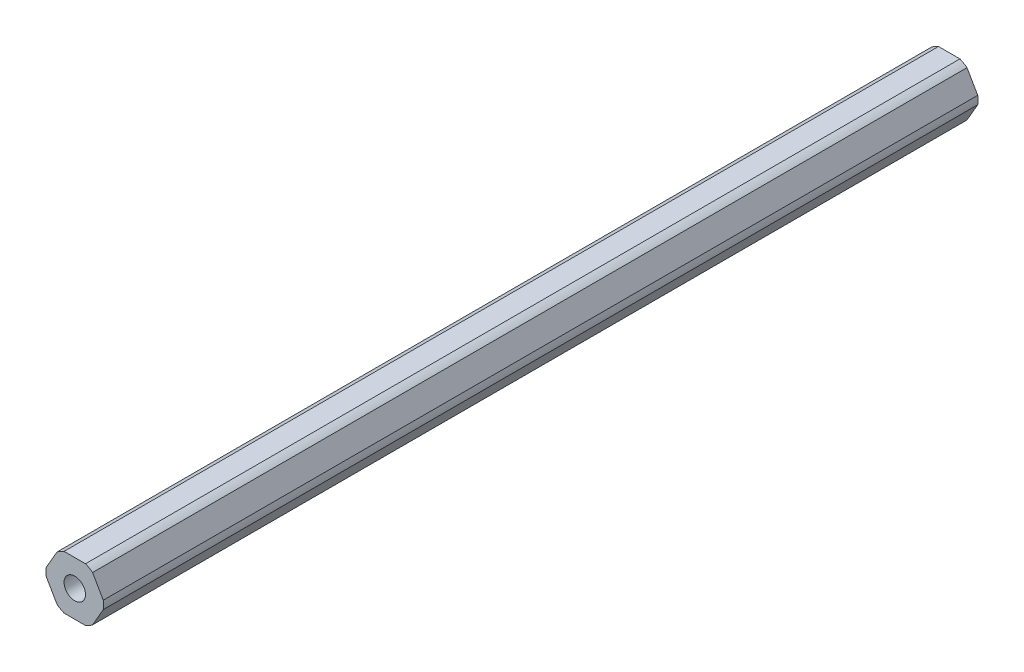
ISO-10303-21;
HEADER;
FILE_DESCRIPTION(('STEP AP214'),'2;1');
FILE_NAME('part.step','',(''),(''),'','','');
FILE_SCHEMA(('AUTOMOTIVE_DESIGN { 1 0 10303 214 1 1 1 1 }'));
ENDSEC;
DATA;
#1=APPLICATION_CONTEXT('core data for automotive mechanical design processes');
#2=APPLICATION_PROTOCOL_DEFINITION('international standard','automotive_design',2000,#1);
#3=PRODUCT_CONTEXT('',#1,'mechanical');
#4=PRODUCT('Part','Part','',(#3));
#5=PRODUCT_RELATED_PRODUCT_CATEGORY('part','',(#4));
#6=PRODUCT_DEFINITION_FORMATION('','',#4);
#7=PRODUCT_DEFINITION_CONTEXT('part definition',#1,'design');
#8=PRODUCT_DEFINITION('design','',#6,#7);
#9=PRODUCT_DEFINITION_SHAPE('','',#8);
#10=(LENGTH_UNIT() NAMED_UNIT(*) SI_UNIT(.MILLI.,.METRE.));
#11=(NAMED_UNIT(*) PLANE_ANGLE_UNIT() SI_UNIT($,.RADIAN.));
#12=(NAMED_UNIT(*) SI_UNIT($,.STERADIAN.) SOLID_ANGLE_UNIT());
#13=UNCERTAINTY_MEASURE_WITH_UNIT(LENGTH_MEASURE(1.E-05),#10,'distance_accuracy_value','');
#14=(GEOMETRIC_REPRESENTATION_CONTEXT(3) GLOBAL_UNCERTAINTY_ASSIGNED_CONTEXT((#13)) GLOBAL_UNIT_ASSIGNED_CONTEXT((#10,
#11,#12)) REPRESENTATION_CONTEXT('',''));
#15=CARTESIAN_POINT('',(0.,0.,0.));
#16=DIRECTION('',(0.,0.,1.));
#17=DIRECTION('',(1.,0.,0.));
#18=AXIS2_PLACEMENT_3D('',#15,#16,#17);
#19=CARTESIAN_POINT('',(0.,0.,-457.2));
#20=DIRECTION('',(0.,0.,1.));
#21=DIRECTION('',(1.,0.,0.));
#22=AXIS2_PLACEMENT_3D('',#19,#20,#21);
#23=CYLINDRICAL_SURFACE('',#22,6.87);
#24=DIRECTION('',(0.,0.,1.));
#25=VECTOR('',#24,1.);
#26=CARTESIAN_POINT('',(6.80102150534208,-0.971085209378955,457.2));
#27=LINE('',#26,#25);
#28=CARTESIAN_POINT('',(6.80102150534208,-0.971085209378954,457.2));
#29=VERTEX_POINT('',#28);
#30=CARTESIAN_POINT('',(6.80102150534208,-0.971085209378953,248.666));
#31=VERTEX_POINT('',#30);
#32=EDGE_CURVE('E200',#29,#31,#27,.F.);
#33=ORIENTED_EDGE('',*,*,#32,.T.);
#34=CARTESIAN_POINT('',(0.,0.,248.666));
#35=DIRECTION('',(0.,0.,-1.));
#36=DIRECTION('',(0.,1.,0.));
#37=AXIS2_PLACEMENT_3D('',#34,#35,#36);
#38=CIRCLE('',#37,6.87);
#39=CARTESIAN_POINT('',(6.80102150534208,0.971085209378948,248.666));
#40=VERTEX_POINT('',#39);
#41=EDGE_CURVE('E318',#31,#40,#38,.F.);
#42=ORIENTED_EDGE('',*,*,#41,.T.);
#43=DIRECTION('',(0.,0.,1.));
#44=VECTOR('',#43,1.);
#45=CARTESIAN_POINT('',(6.80102150534208,0.97108520937895,457.2));
#46=LINE('',#45,#44);
#47=CARTESIAN_POINT('',(6.80102150534208,0.971085209378948,457.2));
#48=VERTEX_POINT('',#47);
#49=EDGE_CURVE('E178',#40,#48,#46,.T.);
#50=ORIENTED_EDGE('',*,*,#49,.T.);
#51=CARTESIAN_POINT('',(0.,0.,457.2));
#52=DIRECTION('',(0.,0.,1.));
#53=DIRECTION('',(1.,0.,0.));
#54=AXIS2_PLACEMENT_3D('',#51,#52,#53);
#55=CIRCLE('',#54,6.87);
#56=EDGE_CURVE('E82',#48,#29,#55,.F.);
#57=ORIENTED_EDGE('',*,*,#56,.T.);
#58=EDGE_LOOP('',(#33,#42,#50,#57));
#59=FACE_BOUND('',#58,.T.);
#60=ADVANCED_FACE('F53',(#59),#23,.T.);
#61=CARTESIAN_POINT('',(3.68083890619154,6.3754,457.2));
#62=DIRECTION('',(0.,-1.,0.));
#63=DIRECTION('',(1.,0.,0.));
#64=AXIS2_PLACEMENT_3D('',#61,#62,#63);
#65=PLANE('',#64);
#66=DIRECTION('',(1.,0.,0.));
#67=VECTOR('',#66,1.);
#68=CARTESIAN_POINT('',(3.68083890619153,6.3754,248.666));
#69=LINE('',#68,#67);
#70=CARTESIAN_POINT('',(-2.55952629210953,6.3754,248.666));
#71=VERTEX_POINT('',#70);
#72=CARTESIAN_POINT('',(2.55952629210953,6.37540000000001,248.666));
#73=VERTEX_POINT('',#72);
#74=EDGE_CURVE('E71',#71,#73,#69,.T.);
#75=ORIENTED_EDGE('',*,*,#74,.F.);
#76=DIRECTION('',(0.,0.,1.));
#77=VECTOR('',#76,1.);
#78=CARTESIAN_POINT('',(-2.55952629210953,6.37540000000001,-457.2));
#79=LINE('',#78,#77);
#80=CARTESIAN_POINT('',(-2.55952629210953,6.37540000000001,457.2));
#81=VERTEX_POINT('',#80);
#82=EDGE_CURVE('E224',#81,#71,#79,.F.);
#83=ORIENTED_EDGE('',*,*,#82,.F.);
#84=DIRECTION('',(1.,0.,0.));
#85=VECTOR('',#84,1.);
#86=CARTESIAN_POINT('',(0.,6.3754,457.2));
#87=LINE('',#86,#85);
#88=CARTESIAN_POINT('',(2.55952629210953,6.37540000000001,457.2));
#89=VERTEX_POINT('',#88);
#90=EDGE_CURVE('E251',#89,#81,#87,.F.);
#91=ORIENTED_EDGE('',*,*,#90,.F.);
#92=DIRECTION('',(0.,0.,1.));
#93=VECTOR('',#92,1.);
#94=CARTESIAN_POINT('',(2.55952629210953,6.37540000000001,-457.2));
#95=LINE('',#94,#93);
#96=EDGE_CURVE('E185',#73,#89,#95,.T.);
#97=ORIENTED_EDGE('',*,*,#96,.F.);
#98=EDGE_LOOP('',(#75,#83,#91,#97));
#99=FACE_BOUND('',#98,.T.);
#100=ADVANCED_FACE('F282',(#99),#65,.F.);
#101=CARTESIAN_POINT('',(0.,0.,-457.2));
#102=DIRECTION('',(0.,0.,1.));
#103=DIRECTION('',(1.,0.,0.));
#104=AXIS2_PLACEMENT_3D('',#101,#102,#103);
#105=CYLINDRICAL_SURFACE('',#104,6.87);
#106=ORIENTED_EDGE('',*,*,#82,.T.);
#107=CARTESIAN_POINT('',(0.,0.,248.666));
#108=DIRECTION('',(0.,0.,-1.));
#109=DIRECTION('',(0.,1.,0.));
#110=AXIS2_PLACEMENT_3D('',#107,#108,#109);
#111=CIRCLE('',#110,6.87);
#112=CARTESIAN_POINT('',(-4.24149521323255,5.40431479062105,248.666));
#113=VERTEX_POINT('',#112);
#114=EDGE_CURVE('E254',#71,#113,#111,.F.);
#115=ORIENTED_EDGE('',*,*,#114,.T.);
#116=DIRECTION('',(0.,0.,1.));
#117=VECTOR('',#116,1.);
#118=CARTESIAN_POINT('',(-4.24149521323255,5.40431479062104,457.2));
#119=LINE('',#118,#117);
#120=CARTESIAN_POINT('',(-4.24149521323255,5.40431479062105,457.2));
#121=VERTEX_POINT('',#120);
#122=EDGE_CURVE('E221',#113,#121,#119,.T.);
#123=ORIENTED_EDGE('',*,*,#122,.T.);
#124=CARTESIAN_POINT('',(0.,0.,457.2));
#125=DIRECTION('',(0.,0.,1.));
#126=DIRECTION('',(1.,0.,0.));
#127=AXIS2_PLACEMENT_3D('',#124,#125,#126);
#128=CIRCLE('',#127,6.87);
#129=EDGE_CURVE('E247',#81,#121,#128,.T.);
#130=ORIENTED_EDGE('',*,*,#129,.F.);
#131=EDGE_LOOP('',(#106,#115,#123,#130));
#132=FACE_BOUND('',#131,.T.);
#133=ADVANCED_FACE('F283',(#132),#105,.T.);
#134=CARTESIAN_POINT('',(-3.68083890619154,6.3754,457.2));
#135=DIRECTION('',(0.866025403784439,-0.5,0.));
#136=DIRECTION('',(0.5,0.866025403784439,0.));
#137=AXIS2_PLACEMENT_3D('',#134,#135,#136);
#138=PLANE('',#137);
#139=DIRECTION('',(0.5,0.866025403784439,0.));
#140=VECTOR('',#139,1.);
#141=CARTESIAN_POINT('',(-3.68083890619155,6.37539999999999,248.666));
#142=LINE('',#141,#140);
#143=CARTESIAN_POINT('',(-6.80102150534208,0.971085209378961,248.666));
#144=VERTEX_POINT('',#143);
#145=EDGE_CURVE('E258',#144,#113,#142,.T.);
#146=ORIENTED_EDGE('',*,*,#145,.F.);
#147=DIRECTION('',(0.,0.,1.));
#148=VECTOR('',#147,1.);
#149=CARTESIAN_POINT('',(-6.80102150534208,0.971085209378959,-457.2));
#150=LINE('',#149,#148);
#151=CARTESIAN_POINT('',(-6.80102150534208,0.971085209378961,457.2));
#152=VERTEX_POINT('',#151);
#153=EDGE_CURVE('E217',#152,#144,#150,.F.);
#154=ORIENTED_EDGE('',*,*,#153,.F.);
#155=DIRECTION('',(-0.5,-0.866025403784439,0.));
#156=VECTOR('',#155,1.);
#157=CARTESIAN_POINT('',(-4.24149521323255,5.40431479062104,457.2));
#158=LINE('',#157,#156);
#159=EDGE_CURVE('E246',#121,#152,#158,.T.);
#160=ORIENTED_EDGE('',*,*,#159,.F.);
#161=ORIENTED_EDGE('',*,*,#122,.F.);
#162=EDGE_LOOP('',(#146,#154,#160,#161));
#163=FACE_BOUND('',#162,.T.);
#164=ADVANCED_FACE('F286',(#163),#138,.F.);
#165=CARTESIAN_POINT('',(0.,0.,-457.2));
#166=DIRECTION('',(0.,0.,1.));
#167=DIRECTION('',(1.,0.,0.));
#168=AXIS2_PLACEMENT_3D('',#165,#166,#167);
#169=CYLINDRICAL_SURFACE('',#168,6.87);
#170=ORIENTED_EDGE('',*,*,#153,.T.);
#171=CARTESIAN_POINT('',(0.,0.,248.666));
#172=DIRECTION('',(0.,0.,-1.));
#173=DIRECTION('',(0.,1.,0.));
#174=AXIS2_PLACEMENT_3D('',#171,#172,#173);
#175=CIRCLE('',#174,6.87);
#176=CARTESIAN_POINT('',(-6.80102150534208,-0.971085209378955,248.666));
#177=VERTEX_POINT('',#176);
#178=EDGE_CURVE('E262',#144,#177,#175,.F.);
#179=ORIENTED_EDGE('',*,*,#178,.T.);
#180=DIRECTION('',(0.,0.,1.));
#181=VECTOR('',#180,1.);
#182=CARTESIAN_POINT('',(-6.80102150534208,-0.971085209378956,457.2));
#183=LINE('',#182,#181);
#184=CARTESIAN_POINT('',(-6.80102150534208,-0.971085209378955,457.2));
#185=VERTEX_POINT('',#184);
#186=EDGE_CURVE('E214',#177,#185,#183,.T.);
#187=ORIENTED_EDGE('',*,*,#186,.T.);
#188=CARTESIAN_POINT('',(0.,0.,457.2));
#189=DIRECTION('',(0.,0.,1.));
#190=DIRECTION('',(1.,0.,0.));
#191=AXIS2_PLACEMENT_3D('',#188,#189,#190);
#192=CIRCLE('',#191,6.87);
#193=EDGE_CURVE('E242',#152,#185,#192,.T.);
#194=ORIENTED_EDGE('',*,*,#193,.F.);
#195=EDGE_LOOP('',(#170,#179,#187,#194));
#196=FACE_BOUND('',#195,.T.);
#197=ADVANCED_FACE('F335',(#196),#169,.T.);
#198=CARTESIAN_POINT('',(-7.36167781238308,0.,457.2));
#199=DIRECTION('',(0.866025403784439,0.5,0.));
#200=DIRECTION('',(-0.5,0.866025403784439,0.));
#201=AXIS2_PLACEMENT_3D('',#198,#199,#200);
#202=PLANE('',#201);
#203=DIRECTION('',(-0.5,0.866025403784439,0.));
#204=VECTOR('',#203,1.);
#205=CARTESIAN_POINT('',(-7.36167781238308,0.,248.666));
#206=LINE('',#205,#204);
#207=CARTESIAN_POINT('',(-4.24149521323254,-5.40431479062105,248.666));
#208=VERTEX_POINT('',#207);
#209=EDGE_CURVE('E297',#208,#177,#206,.T.);
#210=ORIENTED_EDGE('',*,*,#209,.F.);
#211=DIRECTION('',(0.,0.,1.));
#212=VECTOR('',#211,1.);
#213=CARTESIAN_POINT('',(-4.24149521323255,-5.40431479062105,-457.2));
#214=LINE('',#213,#212);
#215=CARTESIAN_POINT('',(-4.24149521323255,-5.40431479062105,457.2));
#216=VERTEX_POINT('',#215);
#217=EDGE_CURVE('E210',#216,#208,#214,.F.);
#218=ORIENTED_EDGE('',*,*,#217,.F.);
#219=DIRECTION('',(0.5,-0.866025403784439,0.));
#220=VECTOR('',#219,1.);
#221=CARTESIAN_POINT('',(-6.80102150534208,-0.971085209378956,457.2));
#222=LINE('',#221,#220);
#223=EDGE_CURVE('E241',#185,#216,#222,.T.);
#224=ORIENTED_EDGE('',*,*,#223,.F.);
#225=ORIENTED_EDGE('',*,*,#186,.F.);
#226=EDGE_LOOP('',(#210,#218,#224,#225));
#227=FACE_BOUND('',#226,.T.);
#228=ADVANCED_FACE('F295',(#227),#202,.F.);
#229=CARTESIAN_POINT('',(0.,0.,-457.2));
#230=DIRECTION('',(0.,0.,1.));
#231=DIRECTION('',(1.,0.,0.));
#232=AXIS2_PLACEMENT_3D('',#229,#230,#231);
#233=CYLINDRICAL_SURFACE('',#232,6.87);
#234=ORIENTED_EDGE('',*,*,#217,.T.);
#235=CARTESIAN_POINT('',(0.,0.,248.666));
#236=DIRECTION('',(0.,0.,-1.));
#237=DIRECTION('',(0.,1.,0.));
#238=AXIS2_PLACEMENT_3D('',#235,#236,#237);
#239=CIRCLE('',#238,6.87);
#240=CARTESIAN_POINT('',(-2.55952629210953,-6.3754,248.666));
#241=VERTEX_POINT('',#240);
#242=EDGE_CURVE('E330',#208,#241,#239,.F.);
#243=ORIENTED_EDGE('',*,*,#242,.T.);
#244=DIRECTION('',(0.,0.,1.));
#245=VECTOR('',#244,1.);
#246=CARTESIAN_POINT('',(-2.55952629210953,-6.3754,457.2));
#247=LINE('',#246,#245);
#248=CARTESIAN_POINT('',(-2.55952629210953,-6.3754,457.2));
#249=VERTEX_POINT('',#248);
#250=EDGE_CURVE('E207',#241,#249,#247,.T.);
#251=ORIENTED_EDGE('',*,*,#250,.T.);
#252=CARTESIAN_POINT('',(0.,0.,457.2));
#253=DIRECTION('',(0.,0.,1.));
#254=DIRECTION('',(1.,0.,0.));
#255=AXIS2_PLACEMENT_3D('',#252,#253,#254);
#256=CIRCLE('',#255,6.87);
#257=EDGE_CURVE('E237',#216,#249,#256,.T.);
#258=ORIENTED_EDGE('',*,*,#257,.F.);
#259=EDGE_LOOP('',(#234,#243,#251,#258));
#260=FACE_BOUND('',#259,.T.);
#261=ADVANCED_FACE('F300',(#260),#233,.T.);
#262=CARTESIAN_POINT('',(-3.68083890619154,-6.3754,457.2));
#263=DIRECTION('',(0.,1.,0.));
#264=DIRECTION('',(0.,0.,1.));
#265=AXIS2_PLACEMENT_3D('',#262,#263,#264);
#266=PLANE('',#265);
#267=DIRECTION('',(-1.,0.,0.));
#268=VECTOR('',#267,1.);
#269=CARTESIAN_POINT('',(-3.68083890619154,-6.3754,248.666));
#270=LINE('',#269,#268);
#271=CARTESIAN_POINT('',(2.55952629210953,-6.3754,248.666));
#272=VERTEX_POINT('',#271);
#273=EDGE_CURVE('E308',#272,#241,#270,.T.);
#274=ORIENTED_EDGE('',*,*,#273,.F.);
#275=DIRECTION('',(0.,0.,1.));
#276=VECTOR('',#275,1.);
#277=CARTESIAN_POINT('',(2.55952629210953,-6.3754,-457.2));
#278=LINE('',#277,#276);
#279=CARTESIAN_POINT('',(2.55952629210953,-6.3754,457.2));
#280=VERTEX_POINT('',#279);
#281=EDGE_CURVE('E203',#280,#272,#278,.F.);
#282=ORIENTED_EDGE('',*,*,#281,.F.);
#283=DIRECTION('',(1.,0.,0.));
#284=VECTOR('',#283,1.);
#285=CARTESIAN_POINT('',(0.,-6.3754,457.2));
#286=LINE('',#285,#284);
#287=EDGE_CURVE('E236',#249,#280,#286,.T.);
#288=ORIENTED_EDGE('',*,*,#287,.F.);
#289=ORIENTED_EDGE('',*,*,#250,.F.);
#290=EDGE_LOOP('',(#274,#282,#288,#289));
#291=FACE_BOUND('',#290,.T.);
#292=ADVANCED_FACE('F306',(#291),#266,.F.);
#293=CARTESIAN_POINT('',(0.,0.,-457.2));
#294=DIRECTION('',(0.,0.,1.));
#295=DIRECTION('',(1.,0.,0.));
#296=AXIS2_PLACEMENT_3D('',#293,#294,#295);
#297=CYLINDRICAL_SURFACE('',#296,6.87);
#298=ORIENTED_EDGE('',*,*,#281,.T.);
#299=CARTESIAN_POINT('',(0.,0.,248.666));
#300=DIRECTION('',(0.,0.,-1.));
#301=DIRECTION('',(0.,1.,0.));
#302=AXIS2_PLACEMENT_3D('',#299,#300,#301);
#303=CIRCLE('',#302,6.87);
#304=CARTESIAN_POINT('',(4.24149521323254,-5.40431479062105,248.666));
#305=VERTEX_POINT('',#304);
#306=EDGE_CURVE('E322',#272,#305,#303,.F.);
#307=ORIENTED_EDGE('',*,*,#306,.T.);
#308=DIRECTION('',(0.,0.,1.));
#309=VECTOR('',#308,1.);
#310=CARTESIAN_POINT('',(4.24149521323254,-5.40431479062105,457.2));
#311=LINE('',#310,#309);
#312=CARTESIAN_POINT('',(4.24149521323254,-5.40431479062105,457.2));
#313=VERTEX_POINT('',#312);
#314=EDGE_CURVE('E193',#305,#313,#311,.T.);
#315=ORIENTED_EDGE('',*,*,#314,.T.);
#316=CARTESIAN_POINT('',(0.,0.,457.2));
#317=DIRECTION('',(0.,0.,1.));
#318=DIRECTION('',(1.,0.,0.));
#319=AXIS2_PLACEMENT_3D('',#316,#317,#318);
#320=CIRCLE('',#319,6.87);
#321=EDGE_CURVE('E232',#280,#313,#320,.T.);
#322=ORIENTED_EDGE('',*,*,#321,.F.);
#323=EDGE_LOOP('',(#298,#307,#315,#322));
#324=FACE_BOUND('',#323,.T.);
#325=ADVANCED_FACE('F311',(#324),#297,.T.);
#326=CARTESIAN_POINT('',(3.68083890619154,-6.3754,457.2));
#327=DIRECTION('',(-0.866025403784439,0.5,0.));
#328=DIRECTION('',(-0.5,-0.866025403784439,0.));
#329=AXIS2_PLACEMENT_3D('',#326,#327,#328);
#330=PLANE('',#329);
#331=DIRECTION('',(-0.5,-0.866025403784439,0.));
#332=VECTOR('',#331,1.);
#333=CARTESIAN_POINT('',(3.68083890619153,-6.37540000000002,248.666));
#334=LINE('',#333,#332);
#335=EDGE_CURVE('E317',#31,#305,#334,.T.);
#336=ORIENTED_EDGE('',*,*,#335,.F.);
#337=ORIENTED_EDGE('',*,*,#32,.F.);
#338=DIRECTION('',(0.5,0.866025403784439,0.));
#339=VECTOR('',#338,1.);
#340=CARTESIAN_POINT('',(4.24149521323254,-5.40431479062105,457.2));
#341=LINE('',#340,#339);
#342=EDGE_CURVE('E231',#313,#29,#341,.T.);
#343=ORIENTED_EDGE('',*,*,#342,.F.);
#344=ORIENTED_EDGE('',*,*,#314,.F.);
#345=EDGE_LOOP('',(#336,#337,#343,#344));
#346=FACE_BOUND('',#345,.T.);
#347=ADVANCED_FACE('F316',(#346),#330,.F.);
#348=CARTESIAN_POINT('',(7.36167781238308,0.,457.2));
#349=DIRECTION('',(-0.866025403784439,-0.5,0.));
#350=DIRECTION('',(0.5,-0.866025403784439,0.));
#351=AXIS2_PLACEMENT_3D('',#348,#349,#350);
#352=PLANE('',#351);
#353=DIRECTION('',(0.5,-0.866025403784439,0.));
#354=VECTOR('',#353,1.);
#355=CARTESIAN_POINT('',(7.36167781238309,0.,248.666));
#356=LINE('',#355,#354);
#357=CARTESIAN_POINT('',(4.24149521323254,5.40431479062105,248.666));
#358=VERTEX_POINT('',#357);
#359=EDGE_CURVE('E164',#358,#40,#356,.T.);
#360=ORIENTED_EDGE('',*,*,#359,.F.);
#361=DIRECTION('',(0.,0.,1.));
#362=VECTOR('',#361,1.);
#363=CARTESIAN_POINT('',(4.24149521323254,5.40431479062105,-457.2));
#364=LINE('',#363,#362);
#365=CARTESIAN_POINT('',(4.24149521323254,5.40431479062105,457.2));
#366=VERTEX_POINT('',#365);
#367=EDGE_CURVE('E176',#366,#358,#364,.F.);
#368=ORIENTED_EDGE('',*,*,#367,.F.);
#369=DIRECTION('',(-0.5,0.866025403784438,0.));
#370=VECTOR('',#369,1.);
#371=CARTESIAN_POINT('',(6.80102150534208,0.97108520937895,457.2));
#372=LINE('',#371,#370);
#373=EDGE_CURVE('E190',#48,#366,#372,.T.);
#374=ORIENTED_EDGE('',*,*,#373,.F.);
#375=ORIENTED_EDGE('',*,*,#49,.F.);
#376=EDGE_LOOP('',(#360,#368,#374,#375));
#377=FACE_BOUND('',#376,.T.);
#378=ADVANCED_FACE('F174',(#377),#352,.F.);
#379=CARTESIAN_POINT('',(0.,0.,-457.2));
#380=DIRECTION('',(0.,0.,1.));
#381=DIRECTION('',(1.,0.,0.));
#382=AXIS2_PLACEMENT_3D('',#379,#380,#381);
#383=CYLINDRICAL_SURFACE('',#382,6.87);
#384=ORIENTED_EDGE('',*,*,#367,.T.);
#385=CARTESIAN_POINT('',(0.,0.,248.666));
#386=DIRECTION('',(0.,0.,-1.));
#387=DIRECTION('',(0.,1.,0.));
#388=AXIS2_PLACEMENT_3D('',#385,#386,#387);
#389=CIRCLE('',#388,6.87);
#390=EDGE_CURVE('E160',#358,#73,#389,.F.);
#391=ORIENTED_EDGE('',*,*,#390,.T.);
#392=ORIENTED_EDGE('',*,*,#96,.T.);
#393=CARTESIAN_POINT('',(0.,0.,457.2));
#394=DIRECTION('',(0.,0.,1.));
#395=DIRECTION('',(1.,0.,0.));
#396=AXIS2_PLACEMENT_3D('',#393,#394,#395);
#397=CIRCLE('',#396,6.87);
#398=EDGE_CURVE('E183',#366,#89,#397,.T.);
#399=ORIENTED_EDGE('',*,*,#398,.F.);
#400=EDGE_LOOP('',(#384,#391,#392,#399));
#401=FACE_BOUND('',#400,.T.);
#402=ADVANCED_FACE('F181',(#401),#383,.T.);
#403=CARTESIAN_POINT('',(0.,0.,-457.2));
#404=DIRECTION('',(0.,0.,1.));
#405=DIRECTION('',(1.,0.,0.));
#406=AXIS2_PLACEMENT_3D('',#403,#404,#405);
#407=CYLINDRICAL_SURFACE('',#406,2.55);
#408=CARTESIAN_POINT('',(0.,0.,457.2));
#409=DIRECTION('',(0.,0.,1.));
#410=DIRECTION('',(1.,0.,0.));
#411=AXIS2_PLACEMENT_3D('',#408,#409,#410);
#412=CIRCLE('',#411,2.55);
#413=CARTESIAN_POINT('',(2.55,0.,457.2));
#414=VERTEX_POINT('',#413);
#415=EDGE_CURVE('E61',#414,#414,#412,.F.);
#416=ORIENTED_EDGE('',*,*,#415,.F.);
#417=EDGE_LOOP('',(#416));
#418=FACE_BOUND('',#417,.T.);
#419=CARTESIAN_POINT('',(0.,0.,248.666));
#420=DIRECTION('',(0.,0.,-1.));
#421=DIRECTION('',(0.,1.,0.));
#422=AXIS2_PLACEMENT_3D('',#419,#420,#421);
#423=CIRCLE('',#422,2.55);
#424=CARTESIAN_POINT('',(0.,2.55,248.666));
#425=VERTEX_POINT('',#424);
#426=EDGE_CURVE('E14',#425,#425,#423,.F.);
#427=ORIENTED_EDGE('',*,*,#426,.F.);
#428=EDGE_LOOP('',(#427));
#429=FACE_BOUND('',#428,.T.);
#430=ADVANCED_FACE('F403',(#418,#429),#407,.F.);
#431=CARTESIAN_POINT('',(0.,0.,457.2));
#432=DIRECTION('',(0.,0.,1.));
#433=DIRECTION('',(1.,0.,0.));
#434=AXIS2_PLACEMENT_3D('',#431,#432,#433);
#435=PLANE('',#434);
#436=ORIENTED_EDGE('',*,*,#342,.T.);
#437=ORIENTED_EDGE('',*,*,#56,.F.);
#438=ORIENTED_EDGE('',*,*,#373,.T.);
#439=ORIENTED_EDGE('',*,*,#398,.T.);
#440=ORIENTED_EDGE('',*,*,#90,.T.);
#441=ORIENTED_EDGE('',*,*,#129,.T.);
#442=ORIENTED_EDGE('',*,*,#159,.T.);
#443=ORIENTED_EDGE('',*,*,#193,.T.);
#444=ORIENTED_EDGE('',*,*,#223,.T.);
#445=ORIENTED_EDGE('',*,*,#257,.T.);
#446=ORIENTED_EDGE('',*,*,#287,.T.);
#447=ORIENTED_EDGE('',*,*,#321,.T.);
#448=EDGE_LOOP('',(#436,#437,#438,#439,#440,#441,#442,#443,#444,#445,#446,#447));
#449=FACE_BOUND('',#448,.T.);
#450=ORIENTED_EDGE('',*,*,#415,.T.);
#451=EDGE_LOOP('',(#450));
#452=FACE_BOUND('',#451,.T.);
#453=ADVANCED_FACE('F277',(#449,#452),#435,.T.);
#454=CARTESIAN_POINT('',(0.,0.,248.666));
#455=DIRECTION('',(0.,0.,-1.));
#456=DIRECTION('',(0.,1.,0.));
#457=AXIS2_PLACEMENT_3D('',#454,#455,#456);
#458=PLANE('',#457);
#459=ORIENTED_EDGE('',*,*,#114,.F.);
#460=ORIENTED_EDGE('',*,*,#74,.T.);
#461=ORIENTED_EDGE('',*,*,#390,.F.);
#462=ORIENTED_EDGE('',*,*,#359,.T.);
#463=ORIENTED_EDGE('',*,*,#41,.F.);
#464=ORIENTED_EDGE('',*,*,#335,.T.);
#465=ORIENTED_EDGE('',*,*,#306,.F.);
#466=ORIENTED_EDGE('',*,*,#273,.T.);
#467=ORIENTED_EDGE('',*,*,#242,.F.);
#468=ORIENTED_EDGE('',*,*,#209,.T.);
#469=ORIENTED_EDGE('',*,*,#178,.F.);
#470=ORIENTED_EDGE('',*,*,#145,.T.);
#471=EDGE_LOOP('',(#459,#460,#461,#462,#463,#464,#465,#466,#467,#468,#469,#470));
#472=FACE_BOUND('',#471,.T.);
#473=ORIENTED_EDGE('',*,*,#426,.T.);
#474=EDGE_LOOP('',(#473));
#475=FACE_BOUND('',#474,.T.);
#476=ADVANCED_FACE('F162',(#472,#475),#458,.T.);
#477=CLOSED_SHELL('',(#60,#100,#133,#164,#197,#228,#261,#292,#325,#347,#378,#402,#430,#453,#476));
#478=MANIFOLD_SOLID_BREP('B2',#477);
#479=ADVANCED_BREP_SHAPE_REPRESENTATION('',(#18,#478),#14);
#480=SHAPE_DEFINITION_REPRESENTATION(#9,#479);
ENDSEC;
END-ISO-10303-21;
